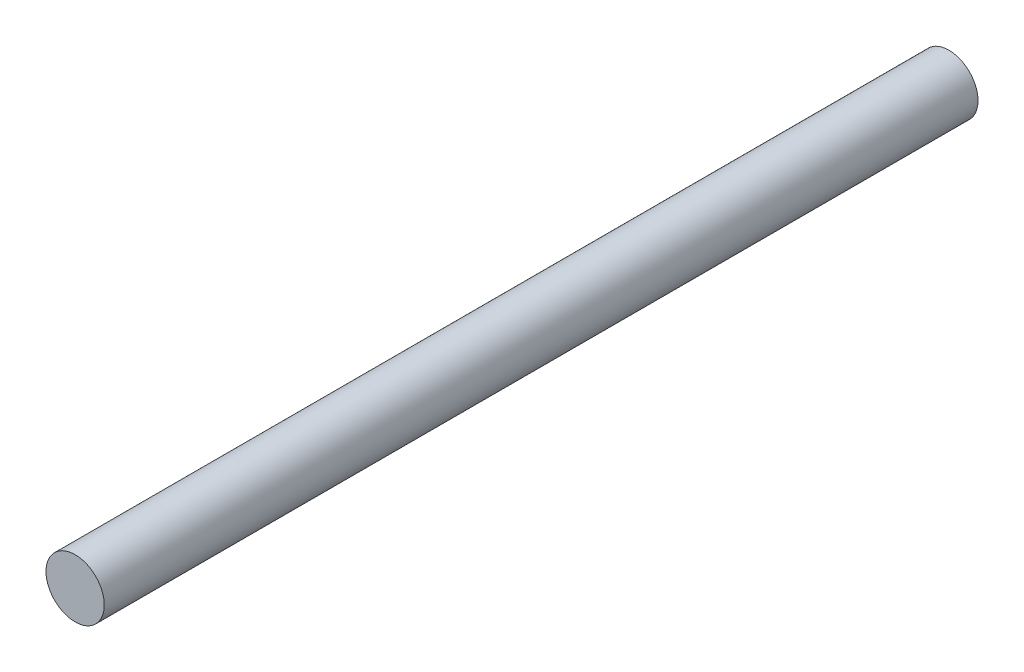
ISO-10303-21;
HEADER;
FILE_DESCRIPTION(('STEP AP214'),'2;1');
FILE_NAME('part.step','',(''),(''),'','','');
FILE_SCHEMA(('AUTOMOTIVE_DESIGN { 1 0 10303 214 1 1 1 1 }'));
ENDSEC;
DATA;
#1=APPLICATION_CONTEXT('core data for automotive mechanical design processes');
#2=APPLICATION_PROTOCOL_DEFINITION('international standard','automotive_design',2000,#1);
#3=PRODUCT_CONTEXT('',#1,'mechanical');
#4=PRODUCT('Part','Part','',(#3));
#5=PRODUCT_RELATED_PRODUCT_CATEGORY('part','',(#4));
#6=PRODUCT_DEFINITION_FORMATION('','',#4);
#7=PRODUCT_DEFINITION_CONTEXT('part definition',#1,'design');
#8=PRODUCT_DEFINITION('design','',#6,#7);
#9=PRODUCT_DEFINITION_SHAPE('','',#8);
#10=(LENGTH_UNIT() NAMED_UNIT(*) SI_UNIT(.MILLI.,.METRE.));
#11=(NAMED_UNIT(*) PLANE_ANGLE_UNIT() SI_UNIT($,.RADIAN.));
#12=(NAMED_UNIT(*) SI_UNIT($,.STERADIAN.) SOLID_ANGLE_UNIT());
#13=UNCERTAINTY_MEASURE_WITH_UNIT(LENGTH_MEASURE(1.E-05),#10,'distance_accuracy_value','');
#14=(GEOMETRIC_REPRESENTATION_CONTEXT(3) GLOBAL_UNCERTAINTY_ASSIGNED_CONTEXT((#13)) GLOBAL_UNIT_ASSIGNED_CONTEXT((#10,
#11,#12)) REPRESENTATION_CONTEXT('',''));
#15=CARTESIAN_POINT('',(0.,0.,0.));
#16=DIRECTION('',(0.,0.,1.));
#17=DIRECTION('',(1.,0.,0.));
#18=AXIS2_PLACEMENT_3D('',#15,#16,#17);
#19=CARTESIAN_POINT('',(-1.00114376488548,0.564120593666722,45.));
#20=DIRECTION('',(0.,0.,-1.));
#21=DIRECTION('',(-1.,0.,0.));
#22=AXIS2_PLACEMENT_3D('',#19,#20,#21);
#23=CYLINDRICAL_SURFACE('',#22,1.5);
#24=CARTESIAN_POINT('',(-1.00114376488548,0.564120593666722,45.));
#25=DIRECTION('',(0.,0.,1.));
#26=DIRECTION('',(1.,0.,0.));
#27=AXIS2_PLACEMENT_3D('',#24,#25,#26);
#28=CIRCLE('',#27,1.5);
#29=CARTESIAN_POINT('',(-2.50114376488548,0.564120593666722,45.));
#30=VERTEX_POINT('',#29);
#31=EDGE_CURVE('E10',#30,#30,#28,.T.);
#32=CARTESIAN_POINT('',(-1.00114376488548,0.564120593666722,0.));
#33=DIRECTION('',(0.,0.,1.));
#34=DIRECTION('',(1.,0.,0.));
#35=AXIS2_PLACEMENT_3D('',#32,#33,#34);
#36=CIRCLE('',#35,1.5);
#37=CARTESIAN_POINT('',(-2.50114376488548,0.564120593666722,0.));
#38=VERTEX_POINT('',#37);
#39=EDGE_CURVE('E34',#38,#38,#36,.T.);
#40=CARTESIAN_POINT('',(-2.50114376488548,0.564120593666722,45.));
#41=CARTESIAN_POINT('',(-2.50114376488548,0.564120593666722,44.53125));
#42=CARTESIAN_POINT('',(-2.50114376488548,0.564120593666722,44.0625));
#43=CARTESIAN_POINT('',(-2.50114376488548,0.564120593666722,43.125));
#44=CARTESIAN_POINT('',(-2.50114376488548,0.564120593666722,42.65625));
#45=CARTESIAN_POINT('',(-2.50114376488548,0.564120593666722,41.71875));
#46=CARTESIAN_POINT('',(-2.50114376488548,0.564120593666722,41.25));
#47=CARTESIAN_POINT('',(-2.50114376488548,0.564120593666722,40.3125));
#48=CARTESIAN_POINT('',(-2.50114376488548,0.564120593666722,39.84375));
#49=CARTESIAN_POINT('',(-2.50114376488548,0.564120593666722,38.90625));
#50=CARTESIAN_POINT('',(-2.50114376488548,0.564120593666722,38.4375));
#51=CARTESIAN_POINT('',(-2.50114376488548,0.564120593666722,37.5));
#52=CARTESIAN_POINT('',(-2.50114376488548,0.564120593666722,37.03125));
#53=CARTESIAN_POINT('',(-2.50114376488548,0.564120593666722,36.09375));
#54=CARTESIAN_POINT('',(-2.50114376488548,0.564120593666722,35.625));
#55=CARTESIAN_POINT('',(-2.50114376488548,0.564120593666722,34.6875));
#56=CARTESIAN_POINT('',(-2.50114376488548,0.564120593666722,34.21875));
#57=CARTESIAN_POINT('',(-2.50114376488548,0.564120593666722,33.28125));
#58=CARTESIAN_POINT('',(-2.50114376488548,0.564120593666722,32.8125));
#59=CARTESIAN_POINT('',(-2.50114376488548,0.564120593666722,31.875));
#60=CARTESIAN_POINT('',(-2.50114376488548,0.564120593666722,31.40625));
#61=CARTESIAN_POINT('',(-2.50114376488548,0.564120593666722,30.46875));
#62=CARTESIAN_POINT('',(-2.50114376488548,0.564120593666722,30.));
#63=CARTESIAN_POINT('',(-2.50114376488548,0.564120593666722,29.0625));
#64=CARTESIAN_POINT('',(-2.50114376488548,0.564120593666722,28.59375));
#65=CARTESIAN_POINT('',(-2.50114376488548,0.564120593666722,27.65625));
#66=CARTESIAN_POINT('',(-2.50114376488548,0.564120593666722,27.1875));
#67=CARTESIAN_POINT('',(-2.50114376488548,0.564120593666722,26.25));
#68=CARTESIAN_POINT('',(-2.50114376488548,0.564120593666722,25.78125));
#69=CARTESIAN_POINT('',(-2.50114376488548,0.564120593666722,24.84375));
#70=CARTESIAN_POINT('',(-2.50114376488548,0.564120593666722,24.375));
#71=CARTESIAN_POINT('',(-2.50114376488548,0.564120593666722,23.4375));
#72=CARTESIAN_POINT('',(-2.50114376488548,0.564120593666722,22.96875));
#73=CARTESIAN_POINT('',(-2.50114376488548,0.564120593666722,22.03125));
#74=CARTESIAN_POINT('',(-2.50114376488548,0.564120593666722,21.5625));
#75=CARTESIAN_POINT('',(-2.50114376488548,0.564120593666722,20.625));
#76=CARTESIAN_POINT('',(-2.50114376488548,0.564120593666722,20.15625));
#77=CARTESIAN_POINT('',(-2.50114376488548,0.564120593666722,19.21875));
#78=CARTESIAN_POINT('',(-2.50114376488548,0.564120593666722,18.75));
#79=CARTESIAN_POINT('',(-2.50114376488548,0.564120593666722,17.8125));
#80=CARTESIAN_POINT('',(-2.50114376488548,0.564120593666722,17.34375));
#81=CARTESIAN_POINT('',(-2.50114376488548,0.564120593666722,16.40625));
#82=CARTESIAN_POINT('',(-2.50114376488548,0.564120593666722,15.9375));
#83=CARTESIAN_POINT('',(-2.50114376488548,0.564120593666722,15.));
#84=CARTESIAN_POINT('',(-2.50114376488548,0.564120593666722,14.53125));
#85=CARTESIAN_POINT('',(-2.50114376488548,0.564120593666722,13.59375));
#86=CARTESIAN_POINT('',(-2.50114376488548,0.564120593666722,13.125));
#87=CARTESIAN_POINT('',(-2.50114376488548,0.564120593666722,12.1875));
#88=CARTESIAN_POINT('',(-2.50114376488548,0.564120593666722,11.71875));
#89=CARTESIAN_POINT('',(-2.50114376488548,0.564120593666722,10.78125));
#90=CARTESIAN_POINT('',(-2.50114376488548,0.564120593666722,10.3125));
#91=CARTESIAN_POINT('',(-2.50114376488548,0.564120593666722,9.37499999999999));
#92=CARTESIAN_POINT('',(-2.50114376488548,0.564120593666722,8.90624999999999));
#93=CARTESIAN_POINT('',(-2.50114376488548,0.564120593666722,7.96874999999999));
#94=CARTESIAN_POINT('',(-2.50114376488548,0.564120593666722,7.5));
#95=CARTESIAN_POINT('',(-2.50114376488548,0.564120593666722,6.56249999999999));
#96=CARTESIAN_POINT('',(-2.50114376488548,0.564120593666722,6.09374999999999));
#97=CARTESIAN_POINT('',(-2.50114376488548,0.564120593666722,5.15624999999999));
#98=CARTESIAN_POINT('',(-2.50114376488548,0.564120593666722,4.68749999999999));
#99=CARTESIAN_POINT('',(-2.50114376488548,0.564120593666722,3.74999999999999));
#100=CARTESIAN_POINT('',(-2.50114376488548,0.564120593666722,3.28124999999999));
#101=CARTESIAN_POINT('',(-2.50114376488548,0.564120593666722,2.34374999999999));
#102=CARTESIAN_POINT('',(-2.50114376488548,0.564120593666722,1.87499999999999));
#103=CARTESIAN_POINT('',(-2.50114376488548,0.564120593666722,0.937499999999992));
#104=CARTESIAN_POINT('',(-2.50114376488548,0.564120593666722,0.468749999999993));
#105=CARTESIAN_POINT('',(-2.50114376488548,0.564120593666722,0.));
#106=B_SPLINE_CURVE_WITH_KNOTS('',3,(#40,#41,#42,#43,#44,#45,#46,#47,#48,#49,#50,#51,#52,#53,
#54,#55,#56,#57,#58,#59,#60,#61,#62,#63,#64,#65,#66,#67,#68,#69,#70,#71,#72,#73,#74,#75,#76,#77,
#78,#79,#80,#81,#82,#83,#84,#85,#86,#87,#88,#89,#90,#91,#92,#93,#94,#95,#96,#97,#98,#99,#100,
#101,#102,#103,#104,#105),.UNSPECIFIED.,.F.,.F.,(4,2,2,2,2,2,2,2,2,2,2,2,2,2,2,2,2,2,2,2,2,2,2,
2,2,2,2,2,2,2,2,2,4),(0.,1.40625,2.8125,4.21874999999999,5.625,7.03125,8.43749999999999,9.84375,
11.25,12.65625,14.0625,15.46875,16.875,18.28125,19.6875,21.09375,22.5,23.90625,25.3125,26.71875,
28.125,29.53125,30.9375,32.34375,33.75,35.15625,36.5625,37.96875,39.375,40.78125,42.1875,
43.59375,45.),.UNSPECIFIED.);
#107=EDGE_CURVE('BSEAM31',#30,#38,#106,.T.);
#108=ORIENTED_EDGE('',*,*,#31,.F.);
#109=ORIENTED_EDGE('',*,*,#39,.T.);
#110=ORIENTED_EDGE('',*,*,#107,.T.);
#111=ORIENTED_EDGE('',*,*,#107,.F.);
#112=EDGE_LOOP('',(#108,#110,#109,#111));
#113=FACE_BOUND('',#112,.T.);
#114=ADVANCED_FACE('F31',(#113),#23,.T.);
#115=CARTESIAN_POINT('',(-1.00114376488548,0.564120593666722,45.));
#116=DIRECTION('',(0.,0.,1.));
#117=DIRECTION('',(1.,0.,0.));
#118=AXIS2_PLACEMENT_3D('',#115,#116,#117);
#119=PLANE('',#118);
#120=ORIENTED_EDGE('',*,*,#31,.T.);
#121=EDGE_LOOP('',(#120));
#122=FACE_BOUND('',#121,.T.);
#123=ADVANCED_FACE('F46',(#122),#119,.T.);
#124=CARTESIAN_POINT('',(-1.00114376488548,0.564120593666722,0.));
#125=DIRECTION('',(0.,0.,1.));
#126=DIRECTION('',(1.,0.,0.));
#127=AXIS2_PLACEMENT_3D('',#124,#125,#126);
#128=PLANE('',#127);
#129=ORIENTED_EDGE('',*,*,#39,.F.);
#130=EDGE_LOOP('',(#129));
#131=FACE_BOUND('',#130,.T.);
#132=ADVANCED_FACE('F44',(#131),#128,.F.);
#133=CLOSED_SHELL('',(#114,#123,#132));
#134=MANIFOLD_SOLID_BREP('B2',#133);
#135=ADVANCED_BREP_SHAPE_REPRESENTATION('',(#18,#134),#14);
#136=SHAPE_DEFINITION_REPRESENTATION(#9,#135);
ENDSEC;
END-ISO-10303-21;
